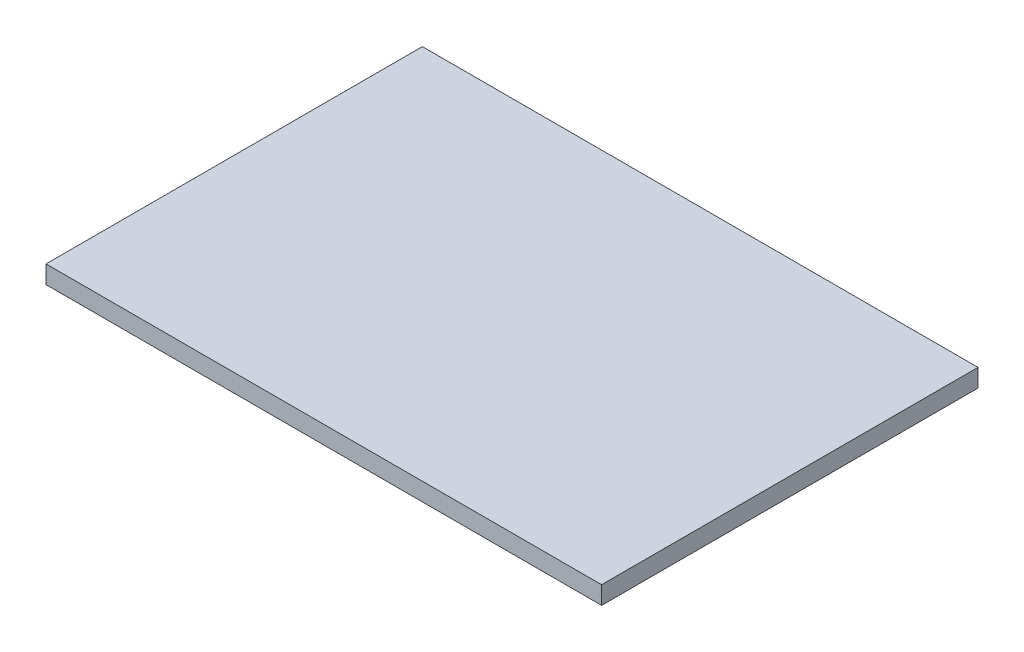
ISO-10303-21;
HEADER;
FILE_DESCRIPTION(('STEP AP214'),'2;1');
FILE_NAME('part.step','',(''),(''),'','','');
FILE_SCHEMA(('AUTOMOTIVE_DESIGN { 1 0 10303 214 1 1 1 1 }'));
ENDSEC;
DATA;
#1=APPLICATION_CONTEXT('core data for automotive mechanical design processes');
#2=APPLICATION_PROTOCOL_DEFINITION('international standard','automotive_design',2000,#1);
#3=PRODUCT_CONTEXT('',#1,'mechanical');
#4=PRODUCT('Part','Part','',(#3));
#5=PRODUCT_RELATED_PRODUCT_CATEGORY('part','',(#4));
#6=PRODUCT_DEFINITION_FORMATION('','',#4);
#7=PRODUCT_DEFINITION_CONTEXT('part definition',#1,'design');
#8=PRODUCT_DEFINITION('design','',#6,#7);
#9=PRODUCT_DEFINITION_SHAPE('','',#8);
#10=(LENGTH_UNIT() NAMED_UNIT(*) SI_UNIT(.MILLI.,.METRE.));
#11=(NAMED_UNIT(*) PLANE_ANGLE_UNIT() SI_UNIT($,.RADIAN.));
#12=(NAMED_UNIT(*) SI_UNIT($,.STERADIAN.) SOLID_ANGLE_UNIT());
#13=UNCERTAINTY_MEASURE_WITH_UNIT(LENGTH_MEASURE(1.E-05),#10,'distance_accuracy_value','');
#14=(GEOMETRIC_REPRESENTATION_CONTEXT(3) GLOBAL_UNCERTAINTY_ASSIGNED_CONTEXT((#13)) GLOBAL_UNIT_ASSIGNED_CONTEXT((#10,
#11,#12)) REPRESENTATION_CONTEXT('',''));
#15=CARTESIAN_POINT('',(0.,0.,0.));
#16=DIRECTION('',(0.,0.,1.));
#17=DIRECTION('',(1.,0.,0.));
#18=AXIS2_PLACEMENT_3D('',#15,#16,#17);
#19=CARTESIAN_POINT('',(0.,5.,0.));
#20=DIRECTION('',(1.,0.,0.));
#21=DIRECTION('',(0.,0.,-1.));
#22=AXIS2_PLACEMENT_3D('',#19,#20,#21);
#23=PLANE('',#22);
#24=DIRECTION('',(0.,0.,1.));
#25=VECTOR('',#24,1.);
#26=CARTESIAN_POINT('',(0.,0.,0.));
#27=LINE('',#26,#25);
#28=CARTESIAN_POINT('',(0.,0.,-105.));
#29=VERTEX_POINT('',#28);
#30=CARTESIAN_POINT('',(0.,0.,0.));
#31=VERTEX_POINT('',#30);
#32=EDGE_CURVE('E107',#29,#31,#27,.T.);
#33=ORIENTED_EDGE('',*,*,#32,.T.);
#34=DIRECTION('',(0.,-1.,0.));
#35=VECTOR('',#34,1.);
#36=CARTESIAN_POINT('',(0.,5.,0.));
#37=LINE('',#36,#35);
#38=CARTESIAN_POINT('',(0.,5.,0.));
#39=VERTEX_POINT('',#38);
#40=EDGE_CURVE('E11',#39,#31,#37,.T.);
#41=ORIENTED_EDGE('',*,*,#40,.F.);
#42=DIRECTION('',(0.,0.,1.));
#43=VECTOR('',#42,1.);
#44=CARTESIAN_POINT('',(0.,5.,0.));
#45=LINE('',#44,#43);
#46=CARTESIAN_POINT('',(0.,5.,-105.));
#47=VERTEX_POINT('',#46);
#48=EDGE_CURVE('E91',#47,#39,#45,.T.);
#49=ORIENTED_EDGE('',*,*,#48,.F.);
#50=DIRECTION('',(0.,-1.,0.));
#51=VECTOR('',#50,1.);
#52=CARTESIAN_POINT('',(0.,5.,-105.));
#53=LINE('',#52,#51);
#54=EDGE_CURVE('E103',#47,#29,#53,.T.);
#55=ORIENTED_EDGE('',*,*,#54,.T.);
#56=EDGE_LOOP('',(#33,#41,#49,#55));
#57=FACE_BOUND('',#56,.T.);
#58=ADVANCED_FACE('F39',(#57),#23,.F.);
#59=CARTESIAN_POINT('',(0.,5.,0.));
#60=DIRECTION('',(0.,0.,-1.));
#61=DIRECTION('',(-1.,0.,0.));
#62=AXIS2_PLACEMENT_3D('',#59,#60,#61);
#63=PLANE('',#62);
#64=DIRECTION('',(1.,0.,0.));
#65=VECTOR('',#64,1.);
#66=CARTESIAN_POINT('',(0.,0.,0.));
#67=LINE('',#66,#65);
#68=CARTESIAN_POINT('',(155.,0.,0.));
#69=VERTEX_POINT('',#68);
#70=EDGE_CURVE('E96',#31,#69,#67,.T.);
#71=ORIENTED_EDGE('',*,*,#70,.T.);
#72=DIRECTION('',(0.,-1.,0.));
#73=VECTOR('',#72,1.);
#74=CARTESIAN_POINT('',(155.,5.,0.));
#75=LINE('',#74,#73);
#76=CARTESIAN_POINT('',(155.,5.,0.));
#77=VERTEX_POINT('',#76);
#78=EDGE_CURVE('E48',#77,#69,#75,.T.);
#79=ORIENTED_EDGE('',*,*,#78,.F.);
#80=DIRECTION('',(1.,0.,0.));
#81=VECTOR('',#80,1.);
#82=CARTESIAN_POINT('',(0.,5.,0.));
#83=LINE('',#82,#81);
#84=EDGE_CURVE('E86',#39,#77,#83,.T.);
#85=ORIENTED_EDGE('',*,*,#84,.F.);
#86=ORIENTED_EDGE('',*,*,#40,.T.);
#87=EDGE_LOOP('',(#71,#79,#85,#86));
#88=FACE_BOUND('',#87,.T.);
#89=ADVANCED_FACE('F95',(#88),#63,.F.);
#90=CARTESIAN_POINT('',(155.,5.,0.));
#91=DIRECTION('',(-1.,0.,0.));
#92=DIRECTION('',(0.,0.,1.));
#93=AXIS2_PLACEMENT_3D('',#90,#91,#92);
#94=PLANE('',#93);
#95=DIRECTION('',(0.,0.,-1.));
#96=VECTOR('',#95,1.);
#97=CARTESIAN_POINT('',(155.,0.,0.));
#98=LINE('',#97,#96);
#99=CARTESIAN_POINT('',(155.,0.,-105.));
#100=VERTEX_POINT('',#99);
#101=EDGE_CURVE('E73',#69,#100,#98,.T.);
#102=ORIENTED_EDGE('',*,*,#101,.T.);
#103=DIRECTION('',(0.,-1.,0.));
#104=VECTOR('',#103,1.);
#105=CARTESIAN_POINT('',(155.,5.,-105.));
#106=LINE('',#105,#104);
#107=CARTESIAN_POINT('',(155.,5.,-105.));
#108=VERTEX_POINT('',#107);
#109=EDGE_CURVE('E98',#108,#100,#106,.T.);
#110=ORIENTED_EDGE('',*,*,#109,.F.);
#111=DIRECTION('',(0.,0.,-1.));
#112=VECTOR('',#111,1.);
#113=CARTESIAN_POINT('',(155.,5.,0.));
#114=LINE('',#113,#112);
#115=EDGE_CURVE('E89',#77,#108,#114,.T.);
#116=ORIENTED_EDGE('',*,*,#115,.F.);
#117=ORIENTED_EDGE('',*,*,#78,.T.);
#118=EDGE_LOOP('',(#102,#110,#116,#117));
#119=FACE_BOUND('',#118,.T.);
#120=ADVANCED_FACE('F99',(#119),#94,.F.);
#121=CARTESIAN_POINT('',(0.,5.,-105.));
#122=DIRECTION('',(0.,0.,1.));
#123=DIRECTION('',(1.,0.,0.));
#124=AXIS2_PLACEMENT_3D('',#121,#122,#123);
#125=PLANE('',#124);
#126=DIRECTION('',(-1.,0.,0.));
#127=VECTOR('',#126,1.);
#128=CARTESIAN_POINT('',(0.,0.,-105.));
#129=LINE('',#128,#127);
#130=EDGE_CURVE('E79',#100,#29,#129,.T.);
#131=ORIENTED_EDGE('',*,*,#130,.T.);
#132=ORIENTED_EDGE('',*,*,#54,.F.);
#133=DIRECTION('',(-1.,0.,0.));
#134=VECTOR('',#133,1.);
#135=CARTESIAN_POINT('',(0.,5.,-105.));
#136=LINE('',#135,#134);
#137=EDGE_CURVE('E56',#108,#47,#136,.T.);
#138=ORIENTED_EDGE('',*,*,#137,.F.);
#139=ORIENTED_EDGE('',*,*,#109,.T.);
#140=EDGE_LOOP('',(#131,#132,#138,#139));
#141=FACE_BOUND('',#140,.T.);
#142=ADVANCED_FACE('F120',(#141),#125,.F.);
#143=CARTESIAN_POINT('',(0.,5.,0.));
#144=DIRECTION('',(0.,-1.,0.));
#145=DIRECTION('',(0.,0.,-1.));
#146=AXIS2_PLACEMENT_3D('',#143,#144,#145);
#147=PLANE('',#146);
#148=ORIENTED_EDGE('',*,*,#48,.T.);
#149=ORIENTED_EDGE('',*,*,#84,.T.);
#150=ORIENTED_EDGE('',*,*,#115,.T.);
#151=ORIENTED_EDGE('',*,*,#137,.T.);
#152=EDGE_LOOP('',(#148,#149,#150,#151));
#153=FACE_BOUND('',#152,.T.);
#154=ADVANCED_FACE('F87',(#153),#147,.F.);
#155=CARTESIAN_POINT('',(0.,0.,0.));
#156=DIRECTION('',(0.,-1.,0.));
#157=DIRECTION('',(0.,0.,-1.));
#158=AXIS2_PLACEMENT_3D('',#155,#156,#157);
#159=PLANE('',#158);
#160=ORIENTED_EDGE('',*,*,#32,.F.);
#161=ORIENTED_EDGE('',*,*,#130,.F.);
#162=ORIENTED_EDGE('',*,*,#101,.F.);
#163=ORIENTED_EDGE('',*,*,#70,.F.);
#164=EDGE_LOOP('',(#160,#161,#162,#163));
#165=FACE_BOUND('',#164,.T.);
#166=ADVANCED_FACE('F123',(#165),#159,.T.);
#167=CLOSED_SHELL('',(#58,#89,#120,#142,#154,#166));
#168=MANIFOLD_SOLID_BREP('B2',#167);
#169=ADVANCED_BREP_SHAPE_REPRESENTATION('',(#18,#168),#14);
#170=SHAPE_DEFINITION_REPRESENTATION(#9,#169);
ENDSEC;
END-ISO-10303-21;
